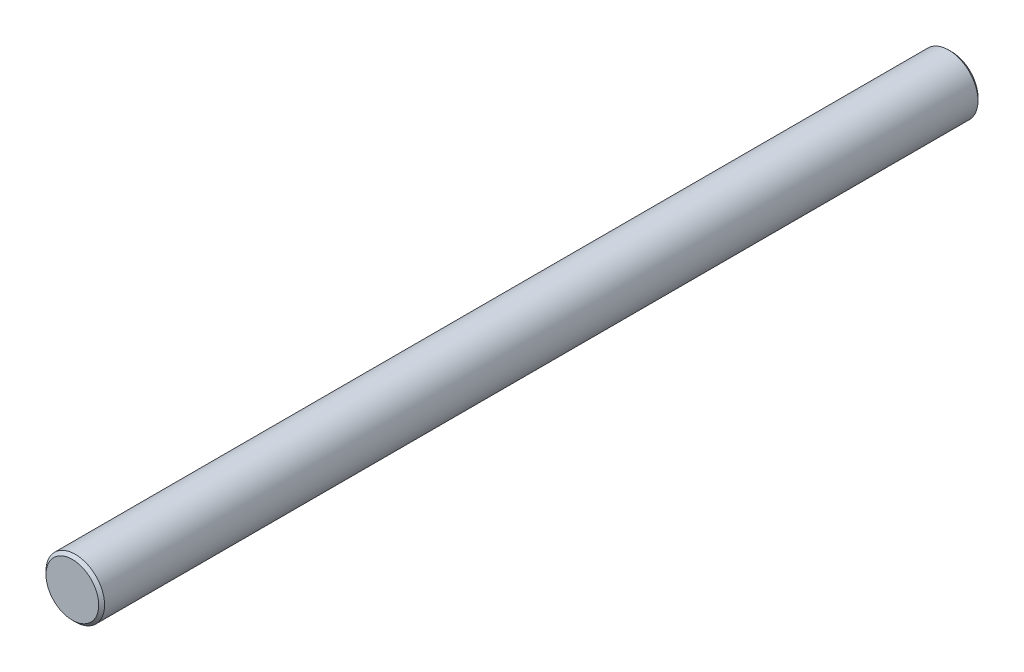
ISO-10303-21;
HEADER;
FILE_DESCRIPTION(('STEP AP214'),'2;1');
FILE_NAME('part.step','',(''),(''),'','','');
FILE_SCHEMA(('AUTOMOTIVE_DESIGN { 1 0 10303 214 1 1 1 1 }'));
ENDSEC;
DATA;
#1=APPLICATION_CONTEXT('core data for automotive mechanical design processes');
#2=APPLICATION_PROTOCOL_DEFINITION('international standard','automotive_design',2000,#1);
#3=PRODUCT_CONTEXT('',#1,'mechanical');
#4=PRODUCT('Part','Part','',(#3));
#5=PRODUCT_RELATED_PRODUCT_CATEGORY('part','',(#4));
#6=PRODUCT_DEFINITION_FORMATION('','',#4);
#7=PRODUCT_DEFINITION_CONTEXT('part definition',#1,'design');
#8=PRODUCT_DEFINITION('design','',#6,#7);
#9=PRODUCT_DEFINITION_SHAPE('','',#8);
#10=(LENGTH_UNIT() NAMED_UNIT(*) SI_UNIT(.MILLI.,.METRE.));
#11=(NAMED_UNIT(*) PLANE_ANGLE_UNIT() SI_UNIT($,.RADIAN.));
#12=(NAMED_UNIT(*) SI_UNIT($,.STERADIAN.) SOLID_ANGLE_UNIT());
#13=UNCERTAINTY_MEASURE_WITH_UNIT(LENGTH_MEASURE(1.E-05),#10,'distance_accuracy_value','');
#14=(GEOMETRIC_REPRESENTATION_CONTEXT(3) GLOBAL_UNCERTAINTY_ASSIGNED_CONTEXT((#13)) GLOBAL_UNIT_ASSIGNED_CONTEXT((#10,
#11,#12)) REPRESENTATION_CONTEXT('',''));
#15=CARTESIAN_POINT('',(0.,0.,0.));
#16=DIRECTION('',(0.,0.,1.));
#17=DIRECTION('',(1.,0.,0.));
#18=AXIS2_PLACEMENT_3D('',#15,#16,#17);
#19=CARTESIAN_POINT('',(0.,0.,60.));
#20=DIRECTION('',(0.,0.,-1.));
#21=DIRECTION('',(-1.,0.,0.));
#22=AXIS2_PLACEMENT_3D('',#19,#20,#21);
#23=CYLINDRICAL_SURFACE('',#22,2.);
#24=CARTESIAN_POINT('',(0.,0.,0.199999999999985));
#25=DIRECTION('',(0.,0.,1.));
#26=DIRECTION('',(1.,0.,0.));
#27=AXIS2_PLACEMENT_3D('',#24,#25,#26);
#28=CIRCLE('',#27,2.);
#29=CARTESIAN_POINT('',(2.,0.,0.199999999999985));
#30=VERTEX_POINT('',#29);
#31=EDGE_CURVE('E43',#30,#30,#28,.T.);
#32=ORIENTED_EDGE('',*,*,#31,.T.);
#33=EDGE_LOOP('',(#32));
#34=FACE_BOUND('',#33,.T.);
#35=CARTESIAN_POINT('',(0.,0.,59.8));
#36=DIRECTION('',(0.,0.,1.));
#37=DIRECTION('',(1.,0.,0.));
#38=AXIS2_PLACEMENT_3D('',#35,#36,#37);
#39=CIRCLE('',#38,2.);
#40=CARTESIAN_POINT('',(2.,0.,59.8));
#41=VERTEX_POINT('',#40);
#42=EDGE_CURVE('E47',#41,#41,#39,.F.);
#43=ORIENTED_EDGE('',*,*,#42,.T.);
#44=EDGE_LOOP('',(#43));
#45=FACE_BOUND('',#44,.T.);
#46=ADVANCED_FACE('F32',(#34,#45),#23,.T.);
#47=CARTESIAN_POINT('',(0.,0.,60.));
#48=DIRECTION('',(0.,0.,1.));
#49=DIRECTION('',(1.,0.,0.));
#50=AXIS2_PLACEMENT_3D('',#47,#48,#49);
#51=PLANE('',#50);
#52=CARTESIAN_POINT('',(0.,0.,60.));
#53=DIRECTION('',(0.,0.,1.));
#54=DIRECTION('',(1.,0.,0.));
#55=AXIS2_PLACEMENT_3D('',#52,#53,#54);
#56=CIRCLE('',#55,1.80000000000001);
#57=CARTESIAN_POINT('',(1.80000000000001,0.,60.));
#58=VERTEX_POINT('',#57);
#59=EDGE_CURVE('E10',#58,#58,#56,.T.);
#60=ORIENTED_EDGE('',*,*,#59,.T.);
#61=EDGE_LOOP('',(#60));
#62=FACE_BOUND('',#61,.T.);
#63=ADVANCED_FACE('F63',(#62),#51,.T.);
#64=CARTESIAN_POINT('',(0.,0.,0.));
#65=DIRECTION('',(0.,0.,1.));
#66=DIRECTION('',(1.,0.,0.));
#67=AXIS2_PLACEMENT_3D('',#64,#65,#66);
#68=PLANE('',#67);
#69=CARTESIAN_POINT('',(0.,0.,0.));
#70=DIRECTION('',(0.,0.,1.));
#71=DIRECTION('',(1.,0.,0.));
#72=AXIS2_PLACEMENT_3D('',#69,#70,#71);
#73=CIRCLE('',#72,1.80000000000001);
#74=CARTESIAN_POINT('',(1.80000000000001,0.,0.));
#75=VERTEX_POINT('',#74);
#76=EDGE_CURVE('E39',#75,#75,#73,.F.);
#77=ORIENTED_EDGE('',*,*,#76,.T.);
#78=EDGE_LOOP('',(#77));
#79=FACE_BOUND('',#78,.T.);
#80=ADVANCED_FACE('F60',(#79),#68,.F.);
#81=CARTESIAN_POINT('',(0.,0.,0.199999999999985));
#82=DIRECTION('',(0.,0.,1.));
#83=DIRECTION('',(1.,0.,0.));
#84=AXIS2_PLACEMENT_3D('',#81,#82,#83);
#85=CONICAL_SURFACE('',#84,2.,0.785398163397466);
#86=ORIENTED_EDGE('',*,*,#76,.F.);
#87=EDGE_LOOP('',(#86));
#88=FACE_BOUND('',#87,.T.);
#89=ORIENTED_EDGE('',*,*,#31,.F.);
#90=EDGE_LOOP('',(#89));
#91=FACE_BOUND('',#90,.T.);
#92=ADVANCED_FACE('F56',(#88,#91),#85,.T.);
#93=CARTESIAN_POINT('',(0.,0.,60.));
#94=DIRECTION('',(0.,0.,-1.));
#95=DIRECTION('',(-1.,0.,0.));
#96=AXIS2_PLACEMENT_3D('',#93,#94,#95);
#97=CONICAL_SURFACE('',#96,1.80000000000001,0.785398163397448);
#98=ORIENTED_EDGE('',*,*,#42,.F.);
#99=EDGE_LOOP('',(#98));
#100=FACE_BOUND('',#99,.T.);
#101=ORIENTED_EDGE('',*,*,#59,.F.);
#102=EDGE_LOOP('',(#101));
#103=FACE_BOUND('',#102,.T.);
#104=ADVANCED_FACE('F34',(#100,#103),#97,.T.);
#105=CLOSED_SHELL('',(#46,#63,#80,#92,#104));
#106=MANIFOLD_SOLID_BREP('B2',#105);
#107=ADVANCED_BREP_SHAPE_REPRESENTATION('',(#18,#106),#14);
#108=SHAPE_DEFINITION_REPRESENTATION(#9,#107);
ENDSEC;
END-ISO-10303-21;
